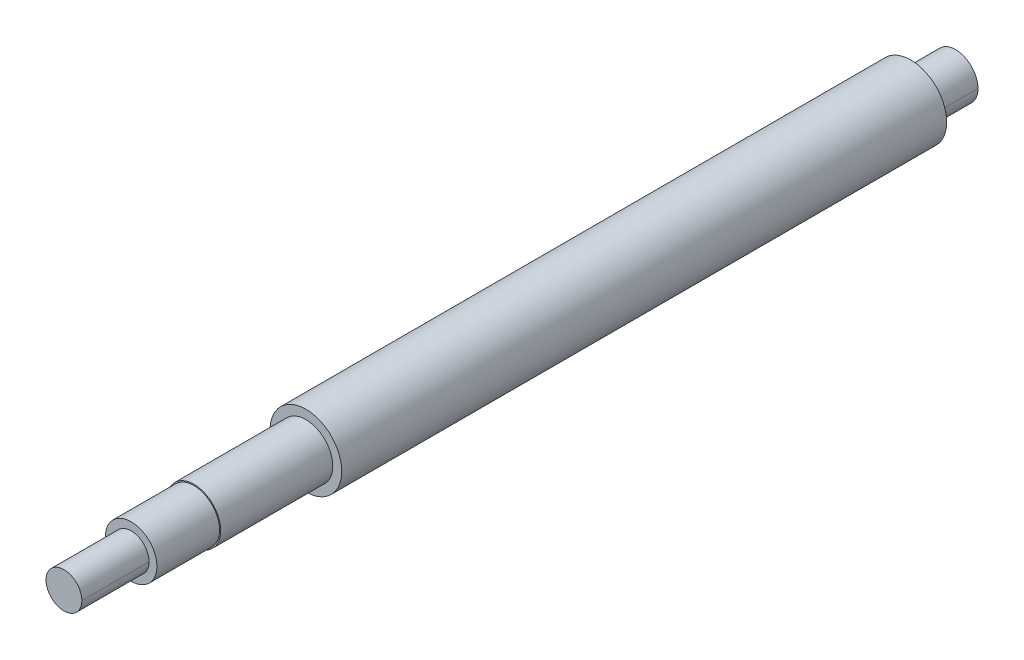
ISO-10303-21;
HEADER;
FILE_DESCRIPTION(('STEP AP214'),'2;1');
FILE_NAME('part.step','',(''),(''),'','','');
FILE_SCHEMA(('AUTOMOTIVE_DESIGN { 1 0 10303 214 1 1 1 1 }'));
ENDSEC;
DATA;
#1=APPLICATION_CONTEXT('core data for automotive mechanical design processes');
#2=APPLICATION_PROTOCOL_DEFINITION('international standard','automotive_design',2000,#1);
#3=PRODUCT_CONTEXT('',#1,'mechanical');
#4=PRODUCT('Part','Part','',(#3));
#5=PRODUCT_RELATED_PRODUCT_CATEGORY('part','',(#4));
#6=PRODUCT_DEFINITION_FORMATION('','',#4);
#7=PRODUCT_DEFINITION_CONTEXT('part definition',#1,'design');
#8=PRODUCT_DEFINITION('design','',#6,#7);
#9=PRODUCT_DEFINITION_SHAPE('','',#8);
#10=(LENGTH_UNIT() NAMED_UNIT(*) SI_UNIT(.MILLI.,.METRE.));
#11=(NAMED_UNIT(*) PLANE_ANGLE_UNIT() SI_UNIT($,.RADIAN.));
#12=(NAMED_UNIT(*) SI_UNIT($,.STERADIAN.) SOLID_ANGLE_UNIT());
#13=UNCERTAINTY_MEASURE_WITH_UNIT(LENGTH_MEASURE(1.E-05),#10,'distance_accuracy_value','');
#14=(GEOMETRIC_REPRESENTATION_CONTEXT(3) GLOBAL_UNCERTAINTY_ASSIGNED_CONTEXT((#13)) GLOBAL_UNIT_ASSIGNED_CONTEXT((#10,
#11,#12)) REPRESENTATION_CONTEXT('',''));
#15=CARTESIAN_POINT('',(0.,0.,0.));
#16=DIRECTION('',(0.,0.,1.));
#17=DIRECTION('',(1.,0.,0.));
#18=AXIS2_PLACEMENT_3D('',#15,#16,#17);
#19=CARTESIAN_POINT('',(0.,0.,10.));
#20=DIRECTION('',(0.,0.,-1.));
#21=DIRECTION('',(-1.,0.,0.));
#22=AXIS2_PLACEMENT_3D('',#19,#20,#21);
#23=CYLINDRICAL_SURFACE('',#22,5.);
#24=CARTESIAN_POINT('',(0.,0.,0.));
#25=DIRECTION('',(0.,0.,1.));
#26=DIRECTION('',(1.,0.,0.));
#27=AXIS2_PLACEMENT_3D('',#24,#25,#26);
#28=CIRCLE('',#27,5.);
#29=CARTESIAN_POINT('',(5.,0.,0.));
#30=VERTEX_POINT('',#29);
#31=CARTESIAN_POINT('',(-5.,0.,0.));
#32=VERTEX_POINT('',#31);
#33=EDGE_CURVE('E138',#30,#32,#28,.T.);
#34=ORIENTED_EDGE('',*,*,#33,.T.);
#35=DIRECTION('',(0.,0.,1.));
#36=VECTOR('',#35,1.);
#37=CARTESIAN_POINT('',(-5.,0.,10.));
#38=LINE('',#37,#36);
#39=CARTESIAN_POINT('',(-5.,0.,10.));
#40=VERTEX_POINT('',#39);
#41=EDGE_CURVE('E12',#32,#40,#38,.T.);
#42=ORIENTED_EDGE('',*,*,#41,.T.);
#43=CARTESIAN_POINT('',(0.,0.,10.));
#44=DIRECTION('',(0.,0.,1.));
#45=DIRECTION('',(1.,0.,0.));
#46=AXIS2_PLACEMENT_3D('',#43,#44,#45);
#47=CIRCLE('',#46,5.);
#48=CARTESIAN_POINT('',(5.,0.,10.));
#49=VERTEX_POINT('',#48);
#50=EDGE_CURVE('E125',#49,#40,#47,.T.);
#51=ORIENTED_EDGE('',*,*,#50,.F.);
#52=DIRECTION('',(0.,0.,-1.));
#53=VECTOR('',#52,1.);
#54=CARTESIAN_POINT('',(5.,0.,10.));
#55=LINE('',#54,#53);
#56=EDGE_CURVE('E53',#49,#30,#55,.T.);
#57=ORIENTED_EDGE('',*,*,#56,.T.);
#58=EDGE_LOOP('',(#34,#42,#51,#57));
#59=FACE_BOUND('',#58,.T.);
#60=ADVANCED_FACE('F44',(#59),#23,.T.);
#61=CARTESIAN_POINT('',(0.,0.,199.));
#62=DIRECTION('',(0.,0.,-1.));
#63=DIRECTION('',(-1.,0.,0.));
#64=AXIS2_PLACEMENT_3D('',#61,#62,#63);
#65=CYLINDRICAL_SURFACE('',#64,4.);
#66=CARTESIAN_POINT('',(0.,0.,184.));
#67=DIRECTION('',(0.,0.,1.));
#68=DIRECTION('',(1.,0.,0.));
#69=AXIS2_PLACEMENT_3D('',#66,#67,#68);
#70=CIRCLE('',#69,4.);
#71=CARTESIAN_POINT('',(4.,0.,184.));
#72=VERTEX_POINT('',#71);
#73=CARTESIAN_POINT('',(-4.,0.,184.));
#74=VERTEX_POINT('',#73);
#75=EDGE_CURVE('E101',#72,#74,#70,.T.);
#76=ORIENTED_EDGE('',*,*,#75,.T.);
#77=DIRECTION('',(0.,0.,1.));
#78=VECTOR('',#77,1.);
#79=CARTESIAN_POINT('',(-4.,0.,199.));
#80=LINE('',#79,#78);
#81=CARTESIAN_POINT('',(-4.,0.,199.));
#82=VERTEX_POINT('',#81);
#83=EDGE_CURVE('E100',#74,#82,#80,.T.);
#84=ORIENTED_EDGE('',*,*,#83,.T.);
#85=CARTESIAN_POINT('',(0.,0.,199.));
#86=DIRECTION('',(0.,0.,1.));
#87=DIRECTION('',(1.,0.,0.));
#88=AXIS2_PLACEMENT_3D('',#85,#86,#87);
#89=CIRCLE('',#88,4.);
#90=CARTESIAN_POINT('',(4.,0.,199.));
#91=VERTEX_POINT('',#90);
#92=EDGE_CURVE('E87',#91,#82,#89,.T.);
#93=ORIENTED_EDGE('',*,*,#92,.F.);
#94=DIRECTION('',(0.,0.,-1.));
#95=VECTOR('',#94,1.);
#96=CARTESIAN_POINT('',(4.,0.,199.));
#97=LINE('',#96,#95);
#98=EDGE_CURVE('E92',#91,#72,#97,.T.);
#99=ORIENTED_EDGE('',*,*,#98,.T.);
#100=EDGE_LOOP('',(#76,#84,#93,#99));
#101=FACE_BOUND('',#100,.T.);
#102=ADVANCED_FACE('F103',(#101),#65,.T.);
#103=ORIENTED_EDGE('',*,*,#41,.F.);
#104=EDGE_CURVE('E130',#32,#30,#28,.T.);
#105=ORIENTED_EDGE('',*,*,#104,.T.);
#106=ORIENTED_EDGE('',*,*,#56,.F.);
#107=EDGE_CURVE('E137',#40,#49,#47,.T.);
#108=ORIENTED_EDGE('',*,*,#107,.F.);
#109=EDGE_LOOP('',(#103,#105,#106,#108));
#110=FACE_BOUND('',#109,.T.);
#111=ADVANCED_FACE('F46',(#110),#23,.T.);
#112=CARTESIAN_POINT('',(0.,0.,0.));
#113=DIRECTION('',(0.,0.,1.));
#114=DIRECTION('',(1.,0.,0.));
#115=AXIS2_PLACEMENT_3D('',#112,#113,#114);
#116=PLANE('',#115);
#117=ORIENTED_EDGE('',*,*,#33,.F.);
#118=ORIENTED_EDGE('',*,*,#104,.F.);
#119=EDGE_LOOP('',(#117,#118));
#120=FACE_BOUND('',#119,.T.);
#121=ADVANCED_FACE('F147',(#120),#116,.F.);
#122=CARTESIAN_POINT('',(0.,0.,145.));
#123=DIRECTION('',(0.,0.,-1.));
#124=DIRECTION('',(-1.,0.,0.));
#125=AXIS2_PLACEMENT_3D('',#122,#123,#124);
#126=CYLINDRICAL_SURFACE('',#125,8.);
#127=CARTESIAN_POINT('',(0.,0.,145.));
#128=DIRECTION('',(0.,0.,1.));
#129=DIRECTION('',(1.,0.,0.));
#130=AXIS2_PLACEMENT_3D('',#127,#128,#129);
#131=CIRCLE('',#130,8.);
#132=CARTESIAN_POINT('',(8.,0.,145.));
#133=VERTEX_POINT('',#132);
#134=EDGE_CURVE('E126',#133,#133,#131,.T.);
#135=ORIENTED_EDGE('',*,*,#134,.F.);
#136=EDGE_LOOP('',(#135));
#137=FACE_BOUND('',#136,.T.);
#138=CARTESIAN_POINT('',(0.,0.,10.));
#139=DIRECTION('',(0.,0.,1.));
#140=DIRECTION('',(1.,0.,0.));
#141=AXIS2_PLACEMENT_3D('',#138,#139,#140);
#142=CIRCLE('',#141,8.);
#143=CARTESIAN_POINT('',(8.,0.,10.));
#144=VERTEX_POINT('',#143);
#145=EDGE_CURVE('E121',#144,#144,#142,.T.);
#146=ORIENTED_EDGE('',*,*,#145,.T.);
#147=EDGE_LOOP('',(#146));
#148=FACE_BOUND('',#147,.T.);
#149=ADVANCED_FACE('F159',(#137,#148),#126,.T.);
#150=CARTESIAN_POINT('',(0.,0.,145.));
#151=DIRECTION('',(0.,0.,1.));
#152=DIRECTION('',(1.,0.,0.));
#153=AXIS2_PLACEMENT_3D('',#150,#151,#152);
#154=PLANE('',#153);
#155=CARTESIAN_POINT('',(0.,0.,145.));
#156=DIRECTION('',(0.,0.,1.));
#157=DIRECTION('',(1.,0.,0.));
#158=AXIS2_PLACEMENT_3D('',#155,#156,#157);
#159=CIRCLE('',#158,6.);
#160=CARTESIAN_POINT('',(6.,0.,145.));
#161=VERTEX_POINT('',#160);
#162=EDGE_CURVE('E117',#161,#161,#159,.T.);
#163=ORIENTED_EDGE('',*,*,#162,.F.);
#164=EDGE_LOOP('',(#163));
#165=FACE_BOUND('',#164,.T.);
#166=ORIENTED_EDGE('',*,*,#134,.T.);
#167=EDGE_LOOP('',(#166));
#168=FACE_BOUND('',#167,.T.);
#169=ADVANCED_FACE('F195',(#165,#168),#154,.T.);
#170=CARTESIAN_POINT('',(0.,0.,10.));
#171=DIRECTION('',(0.,0.,1.));
#172=DIRECTION('',(1.,0.,0.));
#173=AXIS2_PLACEMENT_3D('',#170,#171,#172);
#174=PLANE('',#173);
#175=ORIENTED_EDGE('',*,*,#50,.T.);
#176=ORIENTED_EDGE('',*,*,#107,.T.);
#177=EDGE_LOOP('',(#175,#176));
#178=FACE_BOUND('',#177,.T.);
#179=ORIENTED_EDGE('',*,*,#145,.F.);
#180=EDGE_LOOP('',(#179));
#181=FACE_BOUND('',#180,.T.);
#182=ADVANCED_FACE('F152',(#178,#181),#174,.F.);
#183=CARTESIAN_POINT('',(0.,0.,170.));
#184=DIRECTION('',(0.,0.,-1.));
#185=DIRECTION('',(-1.,0.,0.));
#186=AXIS2_PLACEMENT_3D('',#183,#184,#185);
#187=CYLINDRICAL_SURFACE('',#186,6.);
#188=CARTESIAN_POINT('',(0.,0.,170.));
#189=DIRECTION('',(0.,0.,1.));
#190=DIRECTION('',(1.,0.,0.));
#191=AXIS2_PLACEMENT_3D('',#188,#189,#190);
#192=CIRCLE('',#191,6.);
#193=CARTESIAN_POINT('',(6.,0.,170.));
#194=VERTEX_POINT('',#193);
#195=EDGE_CURVE('E108',#194,#194,#192,.T.);
#196=ORIENTED_EDGE('',*,*,#195,.F.);
#197=EDGE_LOOP('',(#196));
#198=FACE_BOUND('',#197,.T.);
#199=ORIENTED_EDGE('',*,*,#162,.T.);
#200=EDGE_LOOP('',(#199));
#201=FACE_BOUND('',#200,.T.);
#202=ADVANCED_FACE('F194',(#198,#201),#187,.T.);
#203=CARTESIAN_POINT('',(0.,0.,170.));
#204=DIRECTION('',(0.,0.,1.));
#205=DIRECTION('',(1.,0.,0.));
#206=AXIS2_PLACEMENT_3D('',#203,#204,#205);
#207=PLANE('',#206);
#208=CARTESIAN_POINT('',(0.,0.,170.));
#209=DIRECTION('',(0.,0.,1.));
#210=DIRECTION('',(1.,0.,0.));
#211=AXIS2_PLACEMENT_3D('',#208,#209,#210);
#212=CIRCLE('',#211,5.75);
#213=CARTESIAN_POINT('',(5.75,0.,170.));
#214=VERTEX_POINT('',#213);
#215=EDGE_CURVE('E113',#214,#214,#212,.T.);
#216=ORIENTED_EDGE('',*,*,#215,.F.);
#217=EDGE_LOOP('',(#216));
#218=FACE_BOUND('',#217,.T.);
#219=ORIENTED_EDGE('',*,*,#195,.T.);
#220=EDGE_LOOP('',(#219));
#221=FACE_BOUND('',#220,.T.);
#222=ADVANCED_FACE('F245',(#218,#221),#207,.T.);
#223=CARTESIAN_POINT('',(0.,0.,184.));
#224=DIRECTION('',(0.,0.,-1.));
#225=DIRECTION('',(-1.,0.,0.));
#226=AXIS2_PLACEMENT_3D('',#223,#224,#225);
#227=CYLINDRICAL_SURFACE('',#226,5.75);
#228=CARTESIAN_POINT('',(0.,0.,184.));
#229=DIRECTION('',(0.,0.,1.));
#230=DIRECTION('',(1.,0.,0.));
#231=AXIS2_PLACEMENT_3D('',#228,#229,#230);
#232=CIRCLE('',#231,5.75);
#233=CARTESIAN_POINT('',(5.75,0.,184.));
#234=VERTEX_POINT('',#233);
#235=EDGE_CURVE('E105',#234,#234,#232,.T.);
#236=ORIENTED_EDGE('',*,*,#235,.F.);
#237=EDGE_LOOP('',(#236));
#238=FACE_BOUND('',#237,.T.);
#239=ORIENTED_EDGE('',*,*,#215,.T.);
#240=EDGE_LOOP('',(#239));
#241=FACE_BOUND('',#240,.T.);
#242=ADVANCED_FACE('F210',(#238,#241),#227,.T.);
#243=CARTESIAN_POINT('',(0.,0.,184.));
#244=DIRECTION('',(0.,0.,1.));
#245=DIRECTION('',(1.,0.,0.));
#246=AXIS2_PLACEMENT_3D('',#243,#244,#245);
#247=PLANE('',#246);
#248=ORIENTED_EDGE('',*,*,#75,.F.);
#249=EDGE_CURVE('E95',#74,#72,#70,.T.);
#250=ORIENTED_EDGE('',*,*,#249,.F.);
#251=EDGE_LOOP('',(#248,#250));
#252=FACE_BOUND('',#251,.T.);
#253=ORIENTED_EDGE('',*,*,#235,.T.);
#254=EDGE_LOOP('',(#253));
#255=FACE_BOUND('',#254,.T.);
#256=ADVANCED_FACE('F205',(#252,#255),#247,.T.);
#257=ORIENTED_EDGE('',*,*,#83,.F.);
#258=ORIENTED_EDGE('',*,*,#249,.T.);
#259=ORIENTED_EDGE('',*,*,#98,.F.);
#260=EDGE_CURVE('E83',#82,#91,#89,.T.);
#261=ORIENTED_EDGE('',*,*,#260,.F.);
#262=EDGE_LOOP('',(#257,#258,#259,#261));
#263=FACE_BOUND('',#262,.T.);
#264=ADVANCED_FACE('F93',(#263),#65,.T.);
#265=CARTESIAN_POINT('',(0.,0.,199.));
#266=DIRECTION('',(0.,0.,1.));
#267=DIRECTION('',(1.,0.,0.));
#268=AXIS2_PLACEMENT_3D('',#265,#266,#267);
#269=PLANE('',#268);
#270=ORIENTED_EDGE('',*,*,#92,.T.);
#271=ORIENTED_EDGE('',*,*,#260,.T.);
#272=EDGE_LOOP('',(#270,#271));
#273=FACE_BOUND('',#272,.T.);
#274=ADVANCED_FACE('F85',(#273),#269,.T.);
#275=CLOSED_SHELL('',(#60,#102,#111,#121,#149,#169,#182,#202,#222,#242,#256,#264,#274));
#276=MANIFOLD_SOLID_BREP('B2',#275);
#277=ADVANCED_BREP_SHAPE_REPRESENTATION('',(#18,#276),#14);
#278=SHAPE_DEFINITION_REPRESENTATION(#9,#277);
ENDSEC;
END-ISO-10303-21;
